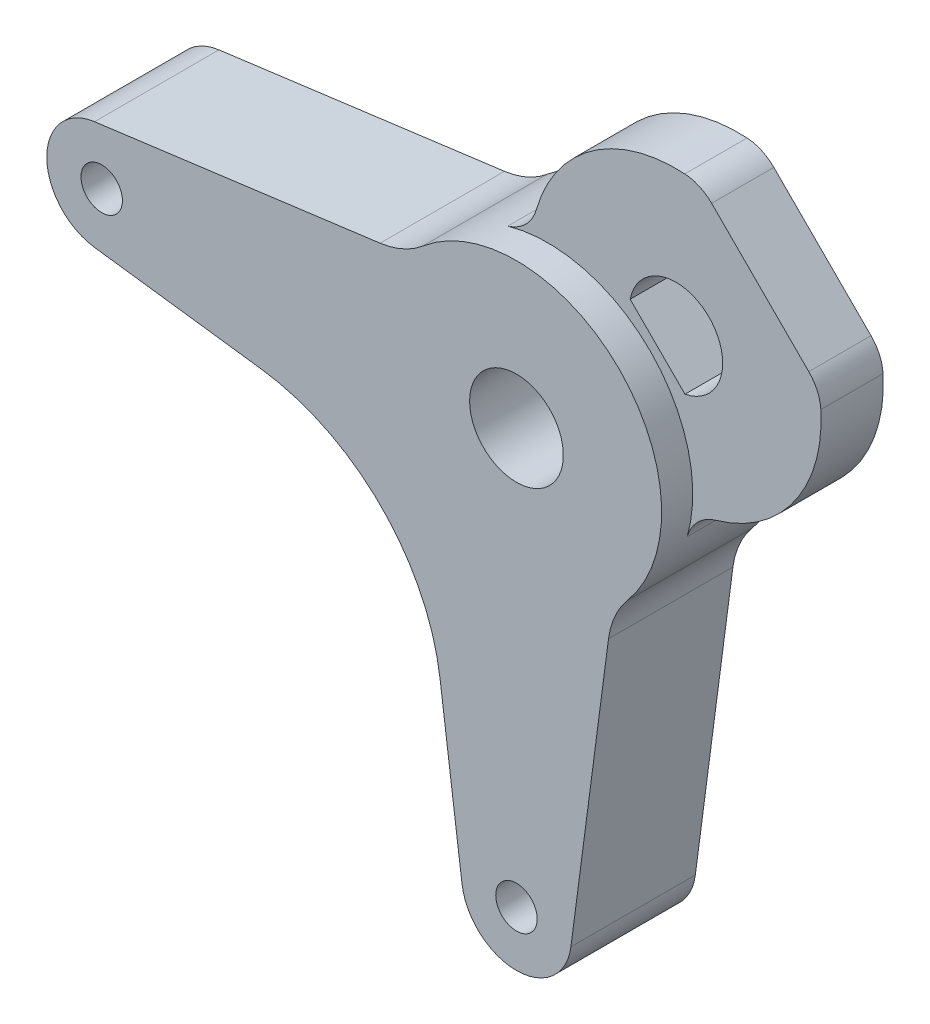
ISO-10303-21;
HEADER;
FILE_DESCRIPTION(('STEP AP214'),'2;1');
FILE_NAME('part.step','',(''),(''),'','','');
FILE_SCHEMA(('AUTOMOTIVE_DESIGN { 1 0 10303 214 1 1 1 1 }'));
ENDSEC;
DATA;
#1=APPLICATION_CONTEXT('core data for automotive mechanical design processes');
#2=APPLICATION_PROTOCOL_DEFINITION('international standard','automotive_design',2000,#1);
#3=PRODUCT_CONTEXT('',#1,'mechanical');
#4=PRODUCT('Part','Part','',(#3));
#5=PRODUCT_RELATED_PRODUCT_CATEGORY('part','',(#4));
#6=PRODUCT_DEFINITION_FORMATION('','',#4);
#7=PRODUCT_DEFINITION_CONTEXT('part definition',#1,'design');
#8=PRODUCT_DEFINITION('design','',#6,#7);
#9=PRODUCT_DEFINITION_SHAPE('','',#8);
#10=(LENGTH_UNIT() NAMED_UNIT(*) SI_UNIT(.MILLI.,.METRE.));
#11=(NAMED_UNIT(*) PLANE_ANGLE_UNIT() SI_UNIT($,.RADIAN.));
#12=(NAMED_UNIT(*) SI_UNIT($,.STERADIAN.) SOLID_ANGLE_UNIT());
#13=UNCERTAINTY_MEASURE_WITH_UNIT(LENGTH_MEASURE(1.E-05),#10,'distance_accuracy_value','');
#14=(GEOMETRIC_REPRESENTATION_CONTEXT(3) GLOBAL_UNCERTAINTY_ASSIGNED_CONTEXT((#13)) GLOBAL_UNIT_ASSIGNED_CONTEXT((#10,
#11,#12)) REPRESENTATION_CONTEXT('',''));
#15=CARTESIAN_POINT('',(0.,0.,0.));
#16=DIRECTION('',(0.,0.,1.));
#17=DIRECTION('',(1.,0.,0.));
#18=AXIS2_PLACEMENT_3D('',#15,#16,#17);
#19=CARTESIAN_POINT('',(0.,0.,19.05));
#20=DIRECTION('',(0.,0.,-1.));
#21=DIRECTION('',(-1.,0.,0.));
#22=AXIS2_PLACEMENT_3D('',#19,#20,#21);
#23=CYLINDRICAL_SURFACE('',#22,44.45);
#24=CARTESIAN_POINT('',(0.,0.,-19.05));
#25=DIRECTION('',(0.,0.,1.));
#26=DIRECTION('',(1.,0.,0.));
#27=AXIS2_PLACEMENT_3D('',#24,#25,#26);
#28=CIRCLE('',#27,44.45);
#29=CARTESIAN_POINT('',(33.9599323815582,-28.6797052397684,-19.05));
#30=VERTEX_POINT('',#29);
#31=CARTESIAN_POINT('',(-28.6797052397684,33.9599323815581,-19.05));
#32=VERTEX_POINT('',#31);
#33=EDGE_CURVE('E293',#30,#32,#28,.T.);
#34=ORIENTED_EDGE('',*,*,#33,.T.);
#35=DIRECTION('',(0.,0.,-1.));
#36=VECTOR('',#35,1.);
#37=CARTESIAN_POINT('',(-28.6797052397684,33.9599323815581,19.05));
#38=LINE('',#37,#36);
#39=CARTESIAN_POINT('',(-28.6797052397684,33.9599323815581,19.05));
#40=VERTEX_POINT('',#39);
#41=EDGE_CURVE('E363',#40,#32,#38,.T.);
#42=ORIENTED_EDGE('',*,*,#41,.F.);
#43=CARTESIAN_POINT('',(0.,0.,19.05));
#44=DIRECTION('',(0.,0.,1.));
#45=DIRECTION('',(1.,0.,0.));
#46=AXIS2_PLACEMENT_3D('',#43,#44,#45);
#47=CIRCLE('',#46,44.45);
#48=CARTESIAN_POINT('',(33.9599323815582,-28.6797052397684,19.05));
#49=VERTEX_POINT('',#48);
#50=EDGE_CURVE('E245',#49,#40,#47,.T.);
#51=ORIENTED_EDGE('',*,*,#50,.F.);
#52=DIRECTION('',(0.,0.,-1.));
#53=VECTOR('',#52,1.);
#54=CARTESIAN_POINT('',(33.9599323815582,-28.6797052397684,19.05));
#55=LINE('',#54,#53);
#56=EDGE_CURVE('E366',#49,#30,#55,.T.);
#57=ORIENTED_EDGE('',*,*,#56,.T.);
#58=EDGE_LOOP('',(#34,#42,#51,#57));
#59=FACE_BOUND('',#58,.T.);
#60=CARTESIAN_POINT('',(0.,0.,-9.525));
#61=DIRECTION('',(0.,0.,-1.));
#62=DIRECTION('',(1.,0.,0.));
#63=AXIS2_PLACEMENT_3D('',#60,#61,#62);
#64=CIRCLE('',#63,44.45);
#65=CARTESIAN_POINT('',(-12.1736804671059,42.7504854227973,-9.525));
#66=VERTEX_POINT('',#65);
#67=CARTESIAN_POINT('',(42.7504854227974,-12.1736804671054,-9.525));
#68=VERTEX_POINT('',#67);
#69=EDGE_CURVE('E231',#66,#68,#64,.T.);
#70=ORIENTED_EDGE('',*,*,#69,.T.);
#71=DIRECTION('',(0.,0.,-1.));
#72=VECTOR('',#71,1.);
#73=CARTESIAN_POINT('',(42.7504854227974,-12.1736804671054,19.05));
#74=LINE('',#73,#72);
#75=CARTESIAN_POINT('',(42.7504854227974,-12.1736804671054,9.525));
#76=VERTEX_POINT('',#75);
#77=EDGE_CURVE('E380',#68,#76,#74,.F.);
#78=ORIENTED_EDGE('',*,*,#77,.T.);
#79=CARTESIAN_POINT('',(0.,0.,9.525));
#80=DIRECTION('',(0.,0.,-1.));
#81=DIRECTION('',(1.,0.,0.));
#82=AXIS2_PLACEMENT_3D('',#79,#80,#81);
#83=CIRCLE('',#82,44.45);
#84=CARTESIAN_POINT('',(-12.1736804671059,42.7504854227973,9.525));
#85=VERTEX_POINT('',#84);
#86=EDGE_CURVE('E217',#85,#76,#83,.T.);
#87=ORIENTED_EDGE('',*,*,#86,.F.);
#88=DIRECTION('',(0.,0.,-1.));
#89=VECTOR('',#88,1.);
#90=CARTESIAN_POINT('',(-12.1736804671059,42.7504854227973,19.05));
#91=LINE('',#90,#89);
#92=EDGE_CURVE('E376',#85,#66,#91,.T.);
#93=ORIENTED_EDGE('',*,*,#92,.T.);
#94=EDGE_LOOP('',(#70,#78,#87,#93));
#95=FACE_BOUND('',#94,.T.);
#96=ADVANCED_FACE('F43',(#59,#95),#23,.T.);
#97=CARTESIAN_POINT('',(53.3656080281628,-45.0681082339217,19.05));
#98=DIRECTION('',(0.,0.,-1.));
#99=DIRECTION('',(-1.,0.,0.));
#100=AXIS2_PLACEMENT_3D('',#97,#98,#99);
#101=CYLINDRICAL_SURFACE('',#100,25.4);
#102=CARTESIAN_POINT('',(53.3656080281628,-45.0681082339217,-19.05));
#103=DIRECTION('',(0.,0.,1.));
#104=DIRECTION('',(1.,0.,0.));
#105=AXIS2_PLACEMENT_3D('',#102,#103,#104);
#106=CIRCLE('',#105,25.4);
#107=CARTESIAN_POINT('',(28.182908549268,-41.7527429515326,-19.05));
#108=VERTEX_POINT('',#107);
#109=EDGE_CURVE('E228',#30,#108,#106,.T.);
#110=ORIENTED_EDGE('',*,*,#109,.F.);
#111=ORIENTED_EDGE('',*,*,#56,.F.);
#112=CARTESIAN_POINT('',(53.3656080281628,-45.0681082339217,19.05));
#113=DIRECTION('',(0.,0.,1.));
#114=DIRECTION('',(1.,0.,0.));
#115=AXIS2_PLACEMENT_3D('',#112,#113,#114);
#116=CIRCLE('',#115,25.4);
#117=CARTESIAN_POINT('',(28.182908549268,-41.7527429515326,19.05));
#118=VERTEX_POINT('',#117);
#119=EDGE_CURVE('E241',#49,#118,#116,.T.);
#120=ORIENTED_EDGE('',*,*,#119,.T.);
#121=DIRECTION('',(0.,0.,-1.));
#122=VECTOR('',#121,1.);
#123=CARTESIAN_POINT('',(28.182908549268,-41.7527429515326,19.05));
#124=LINE('',#123,#122);
#125=EDGE_CURVE('E289',#118,#108,#124,.T.);
#126=ORIENTED_EDGE('',*,*,#125,.T.);
#127=EDGE_LOOP('',(#110,#111,#120,#126));
#128=FACE_BOUND('',#127,.T.);
#129=ADVANCED_FACE('F448',(#128),#101,.F.);
#130=CARTESIAN_POINT('',(-45.0681082339217,53.3656080281628,19.05));
#131=DIRECTION('',(0.,0.,-1.));
#132=DIRECTION('',(-1.,0.,0.));
#133=AXIS2_PLACEMENT_3D('',#130,#131,#132);
#134=CYLINDRICAL_SURFACE('',#133,25.4);
#135=CARTESIAN_POINT('',(-45.0681082339217,53.3656080281628,-19.05));
#136=DIRECTION('',(0.,0.,1.));
#137=DIRECTION('',(1.,0.,0.));
#138=AXIS2_PLACEMENT_3D('',#135,#136,#137);
#139=CIRCLE('',#138,25.4);
#140=CARTESIAN_POINT('',(-41.7527429515326,28.182908549268,-19.05));
#141=VERTEX_POINT('',#140);
#142=EDGE_CURVE('E297',#141,#32,#139,.T.);
#143=ORIENTED_EDGE('',*,*,#142,.F.);
#144=DIRECTION('',(0.,0.,-1.));
#145=VECTOR('',#144,1.);
#146=CARTESIAN_POINT('',(-41.7527429515326,28.182908549268,19.05));
#147=LINE('',#146,#145);
#148=CARTESIAN_POINT('',(-41.7527429515326,28.182908549268,19.05));
#149=VERTEX_POINT('',#148);
#150=EDGE_CURVE('E360',#149,#141,#147,.T.);
#151=ORIENTED_EDGE('',*,*,#150,.F.);
#152=CARTESIAN_POINT('',(-45.0681082339217,53.3656080281628,19.05));
#153=DIRECTION('',(0.,0.,1.));
#154=DIRECTION('',(1.,0.,0.));
#155=AXIS2_PLACEMENT_3D('',#152,#153,#154);
#156=CIRCLE('',#155,25.4);
#157=EDGE_CURVE('E249',#149,#40,#156,.T.);
#158=ORIENTED_EDGE('',*,*,#157,.T.);
#159=ORIENTED_EDGE('',*,*,#41,.T.);
#160=EDGE_LOOP('',(#143,#151,#158,#159));
#161=FACE_BOUND('',#160,.T.);
#162=ADVANCED_FACE('F454',(#161),#134,.F.);
#163=CARTESIAN_POINT('',(-4.35848184758556,33.1059564190376,19.05));
#164=DIRECTION('',(-0.130526192220045,0.991444861373811,0.));
#165=DIRECTION('',(-0.991444861373811,-0.130526192220045,0.));
#166=AXIS2_PLACEMENT_3D('',#163,#164,#165);
#167=PLANE('',#166);
#168=DIRECTION('',(0.991444861373811,0.130526192220045,0.));
#169=VECTOR('',#168,1.);
#170=CARTESIAN_POINT('',(-4.35848184758556,33.1059564190376,-19.05));
#171=LINE('',#170,#169);
#172=CARTESIAN_POINT('',(-129.194771816942,16.6709470550283,-19.05));
#173=VERTEX_POINT('',#172);
#174=EDGE_CURVE('E301',#173,#141,#171,.T.);
#175=ORIENTED_EDGE('',*,*,#174,.F.);
#176=DIRECTION('',(0.,0.,-1.));
#177=VECTOR('',#176,1.);
#178=CARTESIAN_POINT('',(-129.194771816942,16.6709470550283,19.05));
#179=LINE('',#178,#177);
#180=CARTESIAN_POINT('',(-129.194771816942,16.6709470550283,19.05));
#181=VERTEX_POINT('',#180);
#182=EDGE_CURVE('E357',#181,#173,#179,.T.);
#183=ORIENTED_EDGE('',*,*,#182,.F.);
#184=DIRECTION('',(0.991444861373811,0.130526192220045,0.));
#185=VECTOR('',#184,1.);
#186=CARTESIAN_POINT('',(-4.35848184758556,33.1059564190376,19.05));
#187=LINE('',#186,#185);
#188=EDGE_CURVE('E253',#181,#149,#187,.T.);
#189=ORIENTED_EDGE('',*,*,#188,.T.);
#190=ORIENTED_EDGE('',*,*,#150,.T.);
#191=EDGE_LOOP('',(#175,#183,#189,#190));
#192=FACE_BOUND('',#191,.T.);
#193=ADVANCED_FACE('F676',(#192),#167,.T.);
#194=CARTESIAN_POINT('',(-127.,0.,19.05));
#195=DIRECTION('',(0.,0.,-1.));
#196=DIRECTION('',(-1.,0.,0.));
#197=AXIS2_PLACEMENT_3D('',#194,#195,#196);
#198=CYLINDRICAL_SURFACE('',#197,16.8148);
#199=CARTESIAN_POINT('',(-127.,0.,-19.05));
#200=DIRECTION('',(0.,0.,1.));
#201=DIRECTION('',(1.,0.,0.));
#202=AXIS2_PLACEMENT_3D('',#199,#200,#201);
#203=CIRCLE('',#202,16.8148);
#204=CARTESIAN_POINT('',(-129.194771816942,-16.6709470550284,-19.05));
#205=VERTEX_POINT('',#204);
#206=EDGE_CURVE('E305',#173,#205,#203,.T.);
#207=ORIENTED_EDGE('',*,*,#206,.T.);
#208=DIRECTION('',(0.,0.,-1.));
#209=VECTOR('',#208,1.);
#210=CARTESIAN_POINT('',(-129.194771816942,-16.6709470550284,19.05));
#211=LINE('',#210,#209);
#212=CARTESIAN_POINT('',(-129.194771816942,-16.6709470550284,19.05));
#213=VERTEX_POINT('',#212);
#214=EDGE_CURVE('E353',#213,#205,#211,.T.);
#215=ORIENTED_EDGE('',*,*,#214,.F.);
#216=CARTESIAN_POINT('',(-127.,0.,19.05));
#217=DIRECTION('',(0.,0.,1.));
#218=DIRECTION('',(1.,0.,0.));
#219=AXIS2_PLACEMENT_3D('',#216,#217,#218);
#220=CIRCLE('',#219,16.8148);
#221=EDGE_CURVE('E257',#181,#213,#220,.T.);
#222=ORIENTED_EDGE('',*,*,#221,.F.);
#223=ORIENTED_EDGE('',*,*,#182,.T.);
#224=EDGE_LOOP('',(#207,#215,#222,#223));
#225=FACE_BOUND('',#224,.T.);
#226=ADVANCED_FACE('F665',(#225),#198,.T.);
#227=CARTESIAN_POINT('',(-4.35848184758554,-33.1059564190376,19.05));
#228=DIRECTION('',(0.130526192220045,0.991444861373811,0.));
#229=DIRECTION('',(-0.991444861373811,0.130526192220045,0.));
#230=AXIS2_PLACEMENT_3D('',#227,#228,#229);
#231=PLANE('',#230);
#232=DIRECTION('',(0.991444861373811,-0.130526192220045,0.));
#233=VECTOR('',#232,1.);
#234=CARTESIAN_POINT('',(-4.35848184758554,-33.1059564190376,-19.05));
#235=LINE('',#234,#233);
#236=CARTESIAN_POINT('',(-78.0699880215687,-23.4016525303045,-19.05));
#237=VERTEX_POINT('',#236);
#238=EDGE_CURVE('E308',#205,#237,#235,.T.);
#239=ORIENTED_EDGE('',*,*,#238,.T.);
#240=DIRECTION('',(0.,0.,-1.));
#241=VECTOR('',#240,1.);
#242=CARTESIAN_POINT('',(-78.0699880215687,-23.4016525303045,19.05));
#243=LINE('',#242,#241);
#244=CARTESIAN_POINT('',(-78.0699880215687,-23.4016525303045,19.05));
#245=VERTEX_POINT('',#244);
#246=EDGE_CURVE('E350',#245,#237,#243,.T.);
#247=ORIENTED_EDGE('',*,*,#246,.F.);
#248=DIRECTION('',(0.991444861373811,-0.130526192220045,0.));
#249=VECTOR('',#248,1.);
#250=CARTESIAN_POINT('',(-4.35848184758554,-33.1059564190376,19.05));
#251=LINE('',#250,#249);
#252=EDGE_CURVE('E260',#213,#245,#251,.T.);
#253=ORIENTED_EDGE('',*,*,#252,.F.);
#254=ORIENTED_EDGE('',*,*,#214,.T.);
#255=EDGE_LOOP('',(#239,#247,#253,#254));
#256=FACE_BOUND('',#255,.T.);
#257=ADVANCED_FACE('F654',(#256),#231,.F.);
#258=CARTESIAN_POINT('',(-86.3584012275415,-86.3584012275415,19.05));
#259=DIRECTION('',(0.,0.,-1.));
#260=DIRECTION('',(-1.,0.,0.));
#261=AXIS2_PLACEMENT_3D('',#258,#259,#260);
#262=CYLINDRICAL_SURFACE('',#261,63.5);
#263=CARTESIAN_POINT('',(-86.3584012275415,-86.3584012275415,-19.05));
#264=DIRECTION('',(0.,0.,1.));
#265=DIRECTION('',(1.,0.,0.));
#266=AXIS2_PLACEMENT_3D('',#263,#264,#265);
#267=CIRCLE('',#266,63.5);
#268=CARTESIAN_POINT('',(-23.4016525303045,-78.0699880215686,-19.05));
#269=VERTEX_POINT('',#268);
#270=EDGE_CURVE('E312',#269,#237,#267,.T.);
#271=ORIENTED_EDGE('',*,*,#270,.F.);
#272=DIRECTION('',(0.,0.,-1.));
#273=VECTOR('',#272,1.);
#274=CARTESIAN_POINT('',(-23.4016525303045,-78.0699880215686,19.05));
#275=LINE('',#274,#273);
#276=CARTESIAN_POINT('',(-23.4016525303045,-78.0699880215686,19.05));
#277=VERTEX_POINT('',#276);
#278=EDGE_CURVE('E347',#277,#269,#275,.T.);
#279=ORIENTED_EDGE('',*,*,#278,.F.);
#280=CARTESIAN_POINT('',(-86.3584012275415,-86.3584012275415,19.05));
#281=DIRECTION('',(0.,0.,1.));
#282=DIRECTION('',(1.,0.,0.));
#283=AXIS2_PLACEMENT_3D('',#280,#281,#282);
#284=CIRCLE('',#283,63.5);
#285=EDGE_CURVE('E263',#277,#245,#284,.T.);
#286=ORIENTED_EDGE('',*,*,#285,.T.);
#287=ORIENTED_EDGE('',*,*,#246,.T.);
#288=EDGE_LOOP('',(#271,#279,#286,#287));
#289=FACE_BOUND('',#288,.T.);
#290=ADVANCED_FACE('F643',(#289),#262,.F.);
#291=CARTESIAN_POINT('',(-33.1059564190376,-4.35848184758555,19.05));
#292=DIRECTION('',(-0.991444861373811,-0.130526192220045,0.));
#293=DIRECTION('',(0.130526192220045,-0.991444861373811,0.));
#294=AXIS2_PLACEMENT_3D('',#291,#292,#293);
#295=PLANE('',#294);
#296=DIRECTION('',(-0.130526192220045,0.991444861373811,0.));
#297=VECTOR('',#296,1.);
#298=CARTESIAN_POINT('',(-33.1059564190376,-4.35848184758555,-19.05));
#299=LINE('',#298,#297);
#300=CARTESIAN_POINT('',(-16.6709470550284,-129.194771816942,-19.05));
#301=VERTEX_POINT('',#300);
#302=EDGE_CURVE('E316',#301,#269,#299,.T.);
#303=ORIENTED_EDGE('',*,*,#302,.F.);
#304=DIRECTION('',(0.,0.,-1.));
#305=VECTOR('',#304,1.);
#306=CARTESIAN_POINT('',(-16.6709470550284,-129.194771816942,19.05));
#307=LINE('',#306,#305);
#308=CARTESIAN_POINT('',(-16.6709470550284,-129.194771816942,19.05));
#309=VERTEX_POINT('',#308);
#310=EDGE_CURVE('E344',#309,#301,#307,.T.);
#311=ORIENTED_EDGE('',*,*,#310,.F.);
#312=DIRECTION('',(-0.130526192220045,0.991444861373811,0.));
#313=VECTOR('',#312,1.);
#314=CARTESIAN_POINT('',(-33.1059564190376,-4.35848184758555,19.05));
#315=LINE('',#314,#313);
#316=EDGE_CURVE('E267',#309,#277,#315,.T.);
#317=ORIENTED_EDGE('',*,*,#316,.T.);
#318=ORIENTED_EDGE('',*,*,#278,.T.);
#319=EDGE_LOOP('',(#303,#311,#317,#318));
#320=FACE_BOUND('',#319,.T.);
#321=ADVANCED_FACE('F632',(#320),#295,.T.);
#322=CARTESIAN_POINT('',(0.,-127.,19.05));
#323=DIRECTION('',(0.,0.,-1.));
#324=DIRECTION('',(-1.,0.,0.));
#325=AXIS2_PLACEMENT_3D('',#322,#323,#324);
#326=CYLINDRICAL_SURFACE('',#325,16.8148);
#327=CARTESIAN_POINT('',(0.,-127.,-19.05));
#328=DIRECTION('',(0.,0.,1.));
#329=DIRECTION('',(1.,0.,0.));
#330=AXIS2_PLACEMENT_3D('',#327,#328,#329);
#331=CIRCLE('',#330,16.8148);
#332=CARTESIAN_POINT('',(16.6709470550284,-129.194771816942,-19.05));
#333=VERTEX_POINT('',#332);
#334=EDGE_CURVE('E320',#301,#333,#331,.T.);
#335=ORIENTED_EDGE('',*,*,#334,.T.);
#336=DIRECTION('',(0.,0.,-1.));
#337=VECTOR('',#336,1.);
#338=CARTESIAN_POINT('',(16.6709470550284,-129.194771816942,19.05));
#339=LINE('',#338,#337);
#340=CARTESIAN_POINT('',(16.6709470550284,-129.194771816942,19.05));
#341=VERTEX_POINT('',#340);
#342=EDGE_CURVE('E340',#341,#333,#339,.T.);
#343=ORIENTED_EDGE('',*,*,#342,.F.);
#344=CARTESIAN_POINT('',(0.,-127.,19.05));
#345=DIRECTION('',(0.,0.,1.));
#346=DIRECTION('',(1.,0.,0.));
#347=AXIS2_PLACEMENT_3D('',#344,#345,#346);
#348=CIRCLE('',#347,16.8148);
#349=EDGE_CURVE('E271',#309,#341,#348,.T.);
#350=ORIENTED_EDGE('',*,*,#349,.F.);
#351=ORIENTED_EDGE('',*,*,#310,.T.);
#352=EDGE_LOOP('',(#335,#343,#350,#351));
#353=FACE_BOUND('',#352,.T.);
#354=ADVANCED_FACE('F621',(#353),#326,.T.);
#355=CARTESIAN_POINT('',(-127.,0.,19.05));
#356=DIRECTION('',(0.,0.,-1.));
#357=DIRECTION('',(-1.,0.,0.));
#358=AXIS2_PLACEMENT_3D('',#355,#356,#357);
#359=CYLINDRICAL_SURFACE('',#358,6.35);
#360=CARTESIAN_POINT('',(-127.,0.,19.05));
#361=DIRECTION('',(0.,0.,1.));
#362=DIRECTION('',(1.,0.,0.));
#363=AXIS2_PLACEMENT_3D('',#360,#361,#362);
#364=CIRCLE('',#363,6.35);
#365=CARTESIAN_POINT('',(-133.35,0.,19.05));
#366=VERTEX_POINT('',#365);
#367=EDGE_CURVE('E281',#366,#366,#364,.T.);
#368=CARTESIAN_POINT('',(-127.,0.,-19.05));
#369=DIRECTION('',(0.,0.,1.));
#370=DIRECTION('',(1.,0.,0.));
#371=AXIS2_PLACEMENT_3D('',#368,#369,#370);
#372=CIRCLE('',#371,6.35);
#373=CARTESIAN_POINT('',(-133.35,0.,-19.05));
#374=VERTEX_POINT('',#373);
#375=EDGE_CURVE('E331',#374,#374,#372,.T.);
#376=CARTESIAN_POINT('',(-133.35,0.,19.05));
#377=CARTESIAN_POINT('',(-133.35,0.,18.653125));
#378=CARTESIAN_POINT('',(-133.35,0.,18.25625));
#379=CARTESIAN_POINT('',(-133.35,0.,17.4625));
#380=CARTESIAN_POINT('',(-133.35,0.,17.065625));
#381=CARTESIAN_POINT('',(-133.35,0.,16.271875));
#382=CARTESIAN_POINT('',(-133.35,0.,15.875));
#383=CARTESIAN_POINT('',(-133.35,0.,15.08125));
#384=CARTESIAN_POINT('',(-133.35,0.,14.684375));
#385=CARTESIAN_POINT('',(-133.35,0.,13.890625));
#386=CARTESIAN_POINT('',(-133.35,0.,13.49375));
#387=CARTESIAN_POINT('',(-133.35,0.,12.7));
#388=CARTESIAN_POINT('',(-133.35,0.,12.303125));
#389=CARTESIAN_POINT('',(-133.35,0.,11.509375));
#390=CARTESIAN_POINT('',(-133.35,0.,11.1125));
#391=CARTESIAN_POINT('',(-133.35,0.,10.31875));
#392=CARTESIAN_POINT('',(-133.35,0.,9.921875));
#393=CARTESIAN_POINT('',(-133.35,0.,9.128125));
#394=CARTESIAN_POINT('',(-133.35,0.,8.73125));
#395=CARTESIAN_POINT('',(-133.35,0.,7.9375));
#396=CARTESIAN_POINT('',(-133.35,0.,7.540625));
#397=CARTESIAN_POINT('',(-133.35,0.,6.746875));
#398=CARTESIAN_POINT('',(-133.35,0.,6.35));
#399=CARTESIAN_POINT('',(-133.35,0.,5.55625));
#400=CARTESIAN_POINT('',(-133.35,0.,5.159375));
#401=CARTESIAN_POINT('',(-133.35,0.,4.365625));
#402=CARTESIAN_POINT('',(-133.35,0.,3.96875));
#403=CARTESIAN_POINT('',(-133.35,0.,3.175));
#404=CARTESIAN_POINT('',(-133.35,0.,2.778125));
#405=CARTESIAN_POINT('',(-133.35,0.,1.984375));
#406=CARTESIAN_POINT('',(-133.35,0.,1.5875));
#407=CARTESIAN_POINT('',(-133.35,0.,0.793749999999997));
#408=CARTESIAN_POINT('',(-133.35,0.,0.396874999999997));
#409=CARTESIAN_POINT('',(-133.35,0.,-0.396875000000004));
#410=CARTESIAN_POINT('',(-133.35,0.,-0.793750000000004));
#411=CARTESIAN_POINT('',(-133.35,0.,-1.5875));
#412=CARTESIAN_POINT('',(-133.35,0.,-1.984375));
#413=CARTESIAN_POINT('',(-133.35,0.,-2.77812500000001));
#414=CARTESIAN_POINT('',(-133.35,0.,-3.17500000000001));
#415=CARTESIAN_POINT('',(-133.35,0.,-3.96875000000001));
#416=CARTESIAN_POINT('',(-133.35,0.,-4.36562500000001));
#417=CARTESIAN_POINT('',(-133.35,0.,-5.15937500000001));
#418=CARTESIAN_POINT('',(-133.35,0.,-5.55625));
#419=CARTESIAN_POINT('',(-133.35,0.,-6.35));
#420=CARTESIAN_POINT('',(-133.35,0.,-6.746875));
#421=CARTESIAN_POINT('',(-133.35,0.,-7.540625));
#422=CARTESIAN_POINT('',(-133.35,0.,-7.93750000000001));
#423=CARTESIAN_POINT('',(-133.35,0.,-8.73125));
#424=CARTESIAN_POINT('',(-133.35,0.,-9.12812500000001));
#425=CARTESIAN_POINT('',(-133.35,0.,-9.92187500000001));
#426=CARTESIAN_POINT('',(-133.35,0.,-10.31875));
#427=CARTESIAN_POINT('',(-133.35,0.,-11.1125));
#428=CARTESIAN_POINT('',(-133.35,0.,-11.509375));
#429=CARTESIAN_POINT('',(-133.35,0.,-12.303125));
#430=CARTESIAN_POINT('',(-133.35,0.,-12.7));
#431=CARTESIAN_POINT('',(-133.35,0.,-13.49375));
#432=CARTESIAN_POINT('',(-133.35,0.,-13.890625));
#433=CARTESIAN_POINT('',(-133.35,0.,-14.684375));
#434=CARTESIAN_POINT('',(-133.35,0.,-15.08125));
#435=CARTESIAN_POINT('',(-133.35,0.,-15.875));
#436=CARTESIAN_POINT('',(-133.35,0.,-16.271875));
#437=CARTESIAN_POINT('',(-133.35,0.,-17.065625));
#438=CARTESIAN_POINT('',(-133.35,0.,-17.4625));
#439=CARTESIAN_POINT('',(-133.35,0.,-18.25625));
#440=CARTESIAN_POINT('',(-133.35,0.,-18.653125));
#441=CARTESIAN_POINT('',(-133.35,0.,-19.05));
#442=B_SPLINE_CURVE_WITH_KNOTS('',3,(#376,#377,#378,#379,#380,#381,#382,#383,#384,#385,#386,
#387,#388,#389,#390,#391,#392,#393,#394,#395,#396,#397,#398,#399,#400,#401,#402,#403,#404,#405,
#406,#407,#408,#409,#410,#411,#412,#413,#414,#415,#416,#417,#418,#419,#420,#421,#422,#423,#424,
#425,#426,#427,#428,#429,#430,#431,#432,#433,#434,#435,#436,#437,#438,#439,#440,#441),
.UNSPECIFIED.,.F.,.F.,(4,2,2,2,2,2,2,2,2,2,2,2,2,2,2,2,2,2,2,2,2,2,2,2,2,2,2,2,2,2,2,2,4),(0.,
1.190625,2.38125,3.571875,4.7625,5.953125,7.14375,8.334375,9.525,10.715625,11.90625,13.096875,
14.2875,15.478125,16.66875,17.859375,19.05,20.240625,21.43125,22.621875,23.8125,25.003125,
26.19375,27.384375,28.575,29.765625,30.95625,32.146875,33.3375,34.528125,35.71875,36.909375,
38.1),.UNSPECIFIED.);
#443=EDGE_CURVE('BSEAM610',#366,#374,#442,.T.);
#444=ORIENTED_EDGE('',*,*,#367,.T.);
#445=ORIENTED_EDGE('',*,*,#375,.F.);
#446=ORIENTED_EDGE('',*,*,#443,.T.);
#447=ORIENTED_EDGE('',*,*,#443,.F.);
#448=EDGE_LOOP('',(#444,#446,#445,#447));
#449=FACE_BOUND('',#448,.T.);
#450=ADVANCED_FACE('F610',(#449),#359,.F.);
#451=CARTESIAN_POINT('',(0.,-127.,19.05));
#452=DIRECTION('',(0.,0.,-1.));
#453=DIRECTION('',(-1.,0.,0.));
#454=AXIS2_PLACEMENT_3D('',#451,#452,#453);
#455=CYLINDRICAL_SURFACE('',#454,6.35);
#456=CARTESIAN_POINT('',(0.,-127.,19.05));
#457=DIRECTION('',(0.,0.,1.));
#458=DIRECTION('',(1.,0.,0.));
#459=AXIS2_PLACEMENT_3D('',#456,#457,#458);
#460=CIRCLE('',#459,6.35);
#461=CARTESIAN_POINT('',(-6.34999999999998,-127.,19.05));
#462=VERTEX_POINT('',#461);
#463=EDGE_CURVE('E277',#462,#462,#460,.T.);
#464=CARTESIAN_POINT('',(0.,-127.,-19.05));
#465=DIRECTION('',(0.,0.,1.));
#466=DIRECTION('',(1.,0.,0.));
#467=AXIS2_PLACEMENT_3D('',#464,#465,#466);
#468=CIRCLE('',#467,6.35);
#469=CARTESIAN_POINT('',(-6.34999999999998,-127.,-19.05));
#470=VERTEX_POINT('',#469);
#471=EDGE_CURVE('E327',#470,#470,#468,.T.);
#472=CARTESIAN_POINT('',(-6.34999999999998,-127.,19.05));
#473=CARTESIAN_POINT('',(-6.34999999999998,-127.,18.653125));
#474=CARTESIAN_POINT('',(-6.34999999999998,-127.,18.25625));
#475=CARTESIAN_POINT('',(-6.34999999999998,-127.,17.4625));
#476=CARTESIAN_POINT('',(-6.34999999999998,-127.,17.065625));
#477=CARTESIAN_POINT('',(-6.34999999999998,-127.,16.271875));
#478=CARTESIAN_POINT('',(-6.34999999999998,-127.,15.875));
#479=CARTESIAN_POINT('',(-6.34999999999998,-127.,15.08125));
#480=CARTESIAN_POINT('',(-6.34999999999998,-127.,14.684375));
#481=CARTESIAN_POINT('',(-6.34999999999998,-127.,13.890625));
#482=CARTESIAN_POINT('',(-6.34999999999998,-127.,13.49375));
#483=CARTESIAN_POINT('',(-6.34999999999998,-127.,12.7));
#484=CARTESIAN_POINT('',(-6.34999999999998,-127.,12.303125));
#485=CARTESIAN_POINT('',(-6.34999999999998,-127.,11.509375));
#486=CARTESIAN_POINT('',(-6.34999999999998,-127.,11.1125));
#487=CARTESIAN_POINT('',(-6.34999999999998,-127.,10.31875));
#488=CARTESIAN_POINT('',(-6.34999999999998,-127.,9.921875));
#489=CARTESIAN_POINT('',(-6.34999999999998,-127.,9.128125));
#490=CARTESIAN_POINT('',(-6.34999999999998,-127.,8.73125));
#491=CARTESIAN_POINT('',(-6.34999999999998,-127.,7.9375));
#492=CARTESIAN_POINT('',(-6.34999999999998,-127.,7.540625));
#493=CARTESIAN_POINT('',(-6.34999999999998,-127.,6.746875));
#494=CARTESIAN_POINT('',(-6.34999999999998,-127.,6.35));
#495=CARTESIAN_POINT('',(-6.34999999999998,-127.,5.55625));
#496=CARTESIAN_POINT('',(-6.34999999999998,-127.,5.159375));
#497=CARTESIAN_POINT('',(-6.34999999999998,-127.,4.365625));
#498=CARTESIAN_POINT('',(-6.34999999999998,-127.,3.96875));
#499=CARTESIAN_POINT('',(-6.34999999999998,-127.,3.175));
#500=CARTESIAN_POINT('',(-6.34999999999998,-127.,2.778125));
#501=CARTESIAN_POINT('',(-6.34999999999998,-127.,1.984375));
#502=CARTESIAN_POINT('',(-6.34999999999998,-127.,1.5875));
#503=CARTESIAN_POINT('',(-6.34999999999998,-127.,0.793749999999997));
#504=CARTESIAN_POINT('',(-6.34999999999998,-127.,0.396874999999997));
#505=CARTESIAN_POINT('',(-6.34999999999998,-127.,-0.396875000000004));
#506=CARTESIAN_POINT('',(-6.34999999999998,-127.,-0.793750000000004));
#507=CARTESIAN_POINT('',(-6.34999999999998,-127.,-1.5875));
#508=CARTESIAN_POINT('',(-6.34999999999998,-127.,-1.984375));
#509=CARTESIAN_POINT('',(-6.34999999999998,-127.,-2.77812500000001));
#510=CARTESIAN_POINT('',(-6.34999999999998,-127.,-3.17500000000001));
#511=CARTESIAN_POINT('',(-6.34999999999998,-127.,-3.96875000000001));
#512=CARTESIAN_POINT('',(-6.34999999999998,-127.,-4.36562500000001));
#513=CARTESIAN_POINT('',(-6.34999999999998,-127.,-5.15937500000001));
#514=CARTESIAN_POINT('',(-6.34999999999998,-127.,-5.55625));
#515=CARTESIAN_POINT('',(-6.34999999999998,-127.,-6.35));
#516=CARTESIAN_POINT('',(-6.34999999999998,-127.,-6.746875));
#517=CARTESIAN_POINT('',(-6.34999999999998,-127.,-7.540625));
#518=CARTESIAN_POINT('',(-6.34999999999998,-127.,-7.93750000000001));
#519=CARTESIAN_POINT('',(-6.34999999999998,-127.,-8.73125));
#520=CARTESIAN_POINT('',(-6.34999999999998,-127.,-9.12812500000001));
#521=CARTESIAN_POINT('',(-6.34999999999998,-127.,-9.92187500000001));
#522=CARTESIAN_POINT('',(-6.34999999999998,-127.,-10.31875));
#523=CARTESIAN_POINT('',(-6.34999999999998,-127.,-11.1125));
#524=CARTESIAN_POINT('',(-6.34999999999998,-127.,-11.509375));
#525=CARTESIAN_POINT('',(-6.34999999999998,-127.,-12.303125));
#526=CARTESIAN_POINT('',(-6.34999999999998,-127.,-12.7));
#527=CARTESIAN_POINT('',(-6.34999999999998,-127.,-13.49375));
#528=CARTESIAN_POINT('',(-6.34999999999998,-127.,-13.890625));
#529=CARTESIAN_POINT('',(-6.34999999999998,-127.,-14.684375));
#530=CARTESIAN_POINT('',(-6.34999999999998,-127.,-15.08125));
#531=CARTESIAN_POINT('',(-6.34999999999998,-127.,-15.875));
#532=CARTESIAN_POINT('',(-6.34999999999998,-127.,-16.271875));
#533=CARTESIAN_POINT('',(-6.34999999999998,-127.,-17.065625));
#534=CARTESIAN_POINT('',(-6.34999999999998,-127.,-17.4625));
#535=CARTESIAN_POINT('',(-6.34999999999998,-127.,-18.25625));
#536=CARTESIAN_POINT('',(-6.34999999999998,-127.,-18.653125));
#537=CARTESIAN_POINT('',(-6.34999999999998,-127.,-19.05));
#538=B_SPLINE_CURVE_WITH_KNOTS('',3,(#472,#473,#474,#475,#476,#477,#478,#479,#480,#481,#482,
#483,#484,#485,#486,#487,#488,#489,#490,#491,#492,#493,#494,#495,#496,#497,#498,#499,#500,#501,
#502,#503,#504,#505,#506,#507,#508,#509,#510,#511,#512,#513,#514,#515,#516,#517,#518,#519,#520,
#521,#522,#523,#524,#525,#526,#527,#528,#529,#530,#531,#532,#533,#534,#535,#536,#537),
.UNSPECIFIED.,.F.,.F.,(4,2,2,2,2,2,2,2,2,2,2,2,2,2,2,2,2,2,2,2,2,2,2,2,2,2,2,2,2,2,2,2,4),(0.,
1.190625,2.38125,3.571875,4.7625,5.953125,7.14375,8.334375,9.525,10.715625,11.90625,13.096875,
14.2875,15.478125,16.66875,17.859375,19.05,20.240625,21.43125,22.621875,23.8125,25.003125,
26.19375,27.384375,28.575,29.765625,30.95625,32.146875,33.3375,34.528125,35.71875,36.909375,
38.1),.UNSPECIFIED.);
#539=EDGE_CURVE('BSEAM599',#462,#470,#538,.T.);
#540=ORIENTED_EDGE('',*,*,#463,.T.);
#541=ORIENTED_EDGE('',*,*,#471,.F.);
#542=ORIENTED_EDGE('',*,*,#539,.T.);
#543=ORIENTED_EDGE('',*,*,#539,.F.);
#544=EDGE_LOOP('',(#540,#542,#541,#543));
#545=FACE_BOUND('',#544,.T.);
#546=ADVANCED_FACE('F599',(#545),#455,.F.);
#547=CARTESIAN_POINT('',(33.1059564190376,-4.35848184758554,19.05));
#548=DIRECTION('',(-0.991444861373811,0.130526192220045,0.));
#549=DIRECTION('',(-0.130526192220045,-0.991444861373811,0.));
#550=AXIS2_PLACEMENT_3D('',#547,#548,#549);
#551=PLANE('',#550);
#552=DIRECTION('',(0.130526192220045,0.991444861373811,0.));
#553=VECTOR('',#552,1.);
#554=CARTESIAN_POINT('',(33.1059564190376,-4.35848184758554,-19.05));
#555=LINE('',#554,#553);
#556=EDGE_CURVE('E323',#333,#108,#555,.T.);
#557=ORIENTED_EDGE('',*,*,#556,.T.);
#558=ORIENTED_EDGE('',*,*,#125,.F.);
#559=DIRECTION('',(0.130526192220045,0.991444861373811,0.));
#560=VECTOR('',#559,1.);
#561=CARTESIAN_POINT('',(33.1059564190376,-4.35848184758554,19.05));
#562=LINE('',#561,#560);
#563=EDGE_CURVE('E274',#341,#118,#562,.T.);
#564=ORIENTED_EDGE('',*,*,#563,.F.);
#565=ORIENTED_EDGE('',*,*,#342,.T.);
#566=EDGE_LOOP('',(#557,#558,#564,#565));
#567=FACE_BOUND('',#566,.T.);
#568=ADVANCED_FACE('F588',(#567),#551,.F.);
#569=CARTESIAN_POINT('',(0.,0.,19.05));
#570=DIRECTION('',(0.,0.,-1.));
#571=DIRECTION('',(-1.,0.,0.));
#572=AXIS2_PLACEMENT_3D('',#569,#570,#571);
#573=CYLINDRICAL_SURFACE('',#572,14.351);
#574=CARTESIAN_POINT('',(0.,0.,19.05));
#575=DIRECTION('',(0.,0.,1.));
#576=DIRECTION('',(1.,0.,0.));
#577=AXIS2_PLACEMENT_3D('',#574,#575,#576);
#578=CIRCLE('',#577,14.351);
#579=CARTESIAN_POINT('',(-14.351,0.,19.05));
#580=VERTEX_POINT('',#579);
#581=EDGE_CURVE('E285',#580,#580,#578,.T.);
#582=CARTESIAN_POINT('',(0.,0.,-19.05));
#583=DIRECTION('',(0.,0.,1.));
#584=DIRECTION('',(1.,0.,0.));
#585=AXIS2_PLACEMENT_3D('',#582,#583,#584);
#586=CIRCLE('',#585,14.351);
#587=CARTESIAN_POINT('',(-14.351,0.,-19.05));
#588=VERTEX_POINT('',#587);
#589=EDGE_CURVE('E246',#588,#588,#586,.T.);
#590=CARTESIAN_POINT('',(-14.351,0.,19.05));
#591=CARTESIAN_POINT('',(-14.351,0.,18.653125));
#592=CARTESIAN_POINT('',(-14.351,0.,18.25625));
#593=CARTESIAN_POINT('',(-14.351,0.,17.4625));
#594=CARTESIAN_POINT('',(-14.351,0.,17.065625));
#595=CARTESIAN_POINT('',(-14.351,0.,16.271875));
#596=CARTESIAN_POINT('',(-14.351,0.,15.875));
#597=CARTESIAN_POINT('',(-14.351,0.,15.08125));
#598=CARTESIAN_POINT('',(-14.351,0.,14.684375));
#599=CARTESIAN_POINT('',(-14.351,0.,13.890625));
#600=CARTESIAN_POINT('',(-14.351,0.,13.49375));
#601=CARTESIAN_POINT('',(-14.351,0.,12.7));
#602=CARTESIAN_POINT('',(-14.351,0.,12.303125));
#603=CARTESIAN_POINT('',(-14.351,0.,11.509375));
#604=CARTESIAN_POINT('',(-14.351,0.,11.1125));
#605=CARTESIAN_POINT('',(-14.351,0.,10.31875));
#606=CARTESIAN_POINT('',(-14.351,0.,9.921875));
#607=CARTESIAN_POINT('',(-14.351,0.,9.128125));
#608=CARTESIAN_POINT('',(-14.351,0.,8.73125));
#609=CARTESIAN_POINT('',(-14.351,0.,7.9375));
#610=CARTESIAN_POINT('',(-14.351,0.,7.540625));
#611=CARTESIAN_POINT('',(-14.351,0.,6.746875));
#612=CARTESIAN_POINT('',(-14.351,0.,6.35));
#613=CARTESIAN_POINT('',(-14.351,0.,5.55625));
#614=CARTESIAN_POINT('',(-14.351,0.,5.159375));
#615=CARTESIAN_POINT('',(-14.351,0.,4.365625));
#616=CARTESIAN_POINT('',(-14.351,0.,3.96875));
#617=CARTESIAN_POINT('',(-14.351,0.,3.175));
#618=CARTESIAN_POINT('',(-14.351,0.,2.778125));
#619=CARTESIAN_POINT('',(-14.351,0.,1.984375));
#620=CARTESIAN_POINT('',(-14.351,0.,1.5875));
#621=CARTESIAN_POINT('',(-14.351,0.,0.79375));
#622=CARTESIAN_POINT('',(-14.351,0.,0.396875));
#623=CARTESIAN_POINT('',(-14.351,0.,-0.396875));
#624=CARTESIAN_POINT('',(-14.351,0.,-0.79375));
#625=CARTESIAN_POINT('',(-14.351,0.,-1.5875));
#626=CARTESIAN_POINT('',(-14.351,0.,-1.984375));
#627=CARTESIAN_POINT('',(-14.351,0.,-2.778125));
#628=CARTESIAN_POINT('',(-14.351,0.,-3.175));
#629=CARTESIAN_POINT('',(-14.351,0.,-3.96875));
#630=CARTESIAN_POINT('',(-14.351,0.,-4.365625));
#631=CARTESIAN_POINT('',(-14.351,0.,-5.159375));
#632=CARTESIAN_POINT('',(-14.351,0.,-5.55625));
#633=CARTESIAN_POINT('',(-14.351,0.,-6.35));
#634=CARTESIAN_POINT('',(-14.351,0.,-6.746875));
#635=CARTESIAN_POINT('',(-14.351,0.,-7.540625));
#636=CARTESIAN_POINT('',(-14.351,0.,-7.9375));
#637=CARTESIAN_POINT('',(-14.351,0.,-8.73125));
#638=CARTESIAN_POINT('',(-14.351,0.,-9.128125));
#639=CARTESIAN_POINT('',(-14.351,0.,-9.921875));
#640=CARTESIAN_POINT('',(-14.351,0.,-10.31875));
#641=CARTESIAN_POINT('',(-14.351,0.,-11.1125));
#642=CARTESIAN_POINT('',(-14.351,0.,-11.509375));
#643=CARTESIAN_POINT('',(-14.351,0.,-12.303125));
#644=CARTESIAN_POINT('',(-14.351,0.,-12.7));
#645=CARTESIAN_POINT('',(-14.351,0.,-13.49375));
#646=CARTESIAN_POINT('',(-14.351,0.,-13.890625));
#647=CARTESIAN_POINT('',(-14.351,0.,-14.684375));
#648=CARTESIAN_POINT('',(-14.351,0.,-15.08125));
#649=CARTESIAN_POINT('',(-14.351,0.,-15.875));
#650=CARTESIAN_POINT('',(-14.351,0.,-16.271875));
#651=CARTESIAN_POINT('',(-14.351,0.,-17.065625));
#652=CARTESIAN_POINT('',(-14.351,0.,-17.4625));
#653=CARTESIAN_POINT('',(-14.351,0.,-18.25625));
#654=CARTESIAN_POINT('',(-14.351,0.,-18.653125));
#655=CARTESIAN_POINT('',(-14.351,0.,-19.05));
#656=B_SPLINE_CURVE_WITH_KNOTS('',3,(#590,#591,#592,#593,#594,#595,#596,#597,#598,#599,#600,
#601,#602,#603,#604,#605,#606,#607,#608,#609,#610,#611,#612,#613,#614,#615,#616,#617,#618,#619,
#620,#621,#622,#623,#624,#625,#626,#627,#628,#629,#630,#631,#632,#633,#634,#635,#636,#637,#638,
#639,#640,#641,#642,#643,#644,#645,#646,#647,#648,#649,#650,#651,#652,#653,#654,#655),
.UNSPECIFIED.,.F.,.F.,(4,2,2,2,2,2,2,2,2,2,2,2,2,2,2,2,2,2,2,2,2,2,2,2,2,2,2,2,2,2,2,2,4),(0.,
1.190625,2.38125,3.571875,4.7625,5.953125,7.14375,8.334375,9.525,10.715625,11.90625,13.096875,
14.2875,15.478125,16.66875,17.859375,19.05,20.240625,21.43125,22.621875,23.8125,25.003125,
26.19375,27.384375,28.575,29.765625,30.95625,32.146875,33.3375,34.528125,35.71875,36.909375,
38.1),.UNSPECIFIED.);
#657=EDGE_CURVE('BSEAM577',#580,#588,#656,.T.);
#658=ORIENTED_EDGE('',*,*,#581,.T.);
#659=ORIENTED_EDGE('',*,*,#589,.F.);
#660=ORIENTED_EDGE('',*,*,#657,.T.);
#661=ORIENTED_EDGE('',*,*,#657,.F.);
#662=EDGE_LOOP('',(#658,#660,#659,#661));
#663=FACE_BOUND('',#662,.T.);
#664=ADVANCED_FACE('F577',(#663),#573,.F.);
#665=CARTESIAN_POINT('',(0.,0.,19.05));
#666=DIRECTION('',(0.,0.,1.));
#667=DIRECTION('',(1.,0.,0.));
#668=AXIS2_PLACEMENT_3D('',#665,#666,#667);
#669=PLANE('',#668);
#670=ORIENTED_EDGE('',*,*,#119,.F.);
#671=ORIENTED_EDGE('',*,*,#50,.T.);
#672=ORIENTED_EDGE('',*,*,#157,.F.);
#673=ORIENTED_EDGE('',*,*,#188,.F.);
#674=ORIENTED_EDGE('',*,*,#221,.T.);
#675=ORIENTED_EDGE('',*,*,#252,.T.);
#676=ORIENTED_EDGE('',*,*,#285,.F.);
#677=ORIENTED_EDGE('',*,*,#316,.F.);
#678=ORIENTED_EDGE('',*,*,#349,.T.);
#679=ORIENTED_EDGE('',*,*,#563,.T.);
#680=EDGE_LOOP('',(#670,#671,#672,#673,#674,#675,#676,#677,#678,#679));
#681=FACE_BOUND('',#680,.T.);
#682=ORIENTED_EDGE('',*,*,#463,.F.);
#683=EDGE_LOOP('',(#682));
#684=FACE_BOUND('',#683,.T.);
#685=ORIENTED_EDGE('',*,*,#367,.F.);
#686=EDGE_LOOP('',(#685));
#687=FACE_BOUND('',#686,.T.);
#688=ORIENTED_EDGE('',*,*,#581,.F.);
#689=EDGE_LOOP('',(#688));
#690=FACE_BOUND('',#689,.T.);
#691=ADVANCED_FACE('F567',(#681,#684,#687,#690),#669,.T.);
#692=CARTESIAN_POINT('',(0.,0.,-19.05));
#693=DIRECTION('',(0.,0.,1.));
#694=DIRECTION('',(1.,0.,0.));
#695=AXIS2_PLACEMENT_3D('',#692,#693,#694);
#696=PLANE('',#695);
#697=ORIENTED_EDGE('',*,*,#109,.T.);
#698=ORIENTED_EDGE('',*,*,#556,.F.);
#699=ORIENTED_EDGE('',*,*,#334,.F.);
#700=ORIENTED_EDGE('',*,*,#302,.T.);
#701=ORIENTED_EDGE('',*,*,#270,.T.);
#702=ORIENTED_EDGE('',*,*,#238,.F.);
#703=ORIENTED_EDGE('',*,*,#206,.F.);
#704=ORIENTED_EDGE('',*,*,#174,.T.);
#705=ORIENTED_EDGE('',*,*,#142,.T.);
#706=ORIENTED_EDGE('',*,*,#33,.F.);
#707=EDGE_LOOP('',(#697,#698,#699,#700,#701,#702,#703,#704,#705,#706));
#708=FACE_BOUND('',#707,.T.);
#709=ORIENTED_EDGE('',*,*,#471,.T.);
#710=EDGE_LOOP('',(#709));
#711=FACE_BOUND('',#710,.T.);
#712=ORIENTED_EDGE('',*,*,#375,.T.);
#713=EDGE_LOOP('',(#712));
#714=FACE_BOUND('',#713,.T.);
#715=ORIENTED_EDGE('',*,*,#589,.T.);
#716=EDGE_LOOP('',(#715));
#717=FACE_BOUND('',#716,.T.);
#718=ADVANCED_FACE('F537',(#708,#711,#714,#717),#696,.F.);
#719=CARTESIAN_POINT('',(39.313034943032,39.3130349430324,9.525));
#720=DIRECTION('',(0.,0.,1.));
#721=DIRECTION('',(1.,0.,0.));
#722=AXIS2_PLACEMENT_3D('',#719,#720,#721);
#723=PLANE('',#722);
#724=CARTESIAN_POINT('',(39.313034943032,39.3130349430324,9.525));
#725=DIRECTION('',(0.,0.,1.));
#726=DIRECTION('',(1.,0.,0.));
#727=AXIS2_PLACEMENT_3D('',#724,#725,#726);
#728=CIRCLE('',#727,44.45);
#729=CARTESIAN_POINT('',(51.4867154101379,-3.43745047976486,9.525));
#730=VERTEX_POINT('',#729);
#731=CARTESIAN_POINT('',(83.6803035128723,42.0237506514124,9.525));
#732=VERTEX_POINT('',#731);
#733=EDGE_CURVE('E221',#730,#732,#728,.T.);
#734=ORIENTED_EDGE('',*,*,#733,.T.);
#735=CARTESIAN_POINT('',(71.0039410643465,41.2492604490181,9.525));
#736=DIRECTION('',(0.,0.,1.));
#737=DIRECTION('',(1.,0.,0.));
#738=AXIS2_PLACEMENT_3D('',#735,#736,#737);
#739=CIRCLE('',#738,12.7);
#740=CARTESIAN_POINT('',(79.9841971854156,50.2295165700873,9.525));
#741=VERTEX_POINT('',#740);
#742=EDGE_CURVE('E399',#732,#741,#739,.T.);
#743=ORIENTED_EDGE('',*,*,#742,.T.);
#744=DIRECTION('',(-0.707106781186551,0.707106781186544,0.));
#745=VECTOR('',#744,1.);
#746=CARTESIAN_POINT('',(47.1463446356126,83.0673691198899,9.525));
#747=LINE('',#746,#745);
#748=CARTESIAN_POINT('',(50.2295165700864,79.9841971854161,9.525));
#749=VERTEX_POINT('',#748);
#750=EDGE_CURVE('E225',#741,#749,#747,.T.);
#751=ORIENTED_EDGE('',*,*,#750,.T.);
#752=CARTESIAN_POINT('',(41.2492604490173,71.0039410643469,9.525));
#753=DIRECTION('',(0.,0.,1.));
#754=DIRECTION('',(1.,0.,0.));
#755=AXIS2_PLACEMENT_3D('',#752,#753,#754);
#756=CIRCLE('',#755,12.7);
#757=CARTESIAN_POINT('',(42.0237506514114,83.6803035128728,9.525));
#758=VERTEX_POINT('',#757);
#759=EDGE_CURVE('E66',#749,#758,#756,.T.);
#760=ORIENTED_EDGE('',*,*,#759,.T.);
#761=CARTESIAN_POINT('',(39.313034943032,39.3130349430324,9.525));
#762=DIRECTION('',(0.,0.,1.));
#763=DIRECTION('',(1.,0.,0.));
#764=AXIS2_PLACEMENT_3D('',#761,#762,#763);
#765=CIRCLE('',#764,44.45);
#766=CARTESIAN_POINT('',(-3.43745047976545,51.4867154101378,9.525));
#767=VERTEX_POINT('',#766);
#768=EDGE_CURVE('E214',#758,#767,#765,.T.);
#769=ORIENTED_EDGE('',*,*,#768,.T.);
#770=CARTESIAN_POINT('',(-15.651874886279,54.9649098293108,9.525));
#771=DIRECTION('',(0.,0.,1.));
#772=DIRECTION('',(1.,0.,0.));
#773=AXIS2_PLACEMENT_3D('',#770,#771,#772);
#774=CIRCLE('',#773,12.7);
#775=EDGE_CURVE('E11',#767,#85,#774,.F.);
#776=ORIENTED_EDGE('',*,*,#775,.T.);
#777=ORIENTED_EDGE('',*,*,#86,.T.);
#778=CARTESIAN_POINT('',(54.964909829311,-15.6518748862784,9.525));
#779=DIRECTION('',(0.,0.,1.));
#780=DIRECTION('',(1.,0.,0.));
#781=AXIS2_PLACEMENT_3D('',#778,#779,#780);
#782=CIRCLE('',#781,12.7);
#783=EDGE_CURVE('E412',#76,#730,#782,.F.);
#784=ORIENTED_EDGE('',*,*,#783,.T.);
#785=EDGE_LOOP('',(#734,#743,#751,#760,#769,#776,#777,#784));
#786=FACE_BOUND('',#785,.T.);
#787=DIRECTION('',(0.707106781186552,-0.707106781186543,0.));
#788=VECTOR('',#787,1.);
#789=CARTESIAN_POINT('',(25.281244781325,42.0706761266935,9.525));
#790=LINE('',#789,#788);
#791=CARTESIAN_POINT('',(25.281244781325,42.0706761266935,9.525));
#792=VERTEX_POINT('',#791);
#793=CARTESIAN_POINT('',(42.0706761266933,25.2812447813255,9.525));
#794=VERTEX_POINT('',#793);
#795=EDGE_CURVE('E183',#792,#794,#790,.T.);
#796=ORIENTED_EDGE('',*,*,#795,.F.);
#797=CARTESIAN_POINT('',(39.313034943032,39.3130349430324,9.525));
#798=DIRECTION('',(0.,0.,1.));
#799=DIRECTION('',(1.,0.,0.));
#800=AXIS2_PLACEMENT_3D('',#797,#798,#799);
#801=CIRCLE('',#800,14.3002);
#802=EDGE_CURVE('E194',#794,#792,#801,.T.);
#803=ORIENTED_EDGE('',*,*,#802,.F.);
#804=EDGE_LOOP('',(#796,#803));
#805=FACE_BOUND('',#804,.T.);
#806=ADVANCED_FACE('F202',(#786,#805),#723,.T.);
#807=CARTESIAN_POINT('',(39.313034943032,39.3130349430324,-9.525));
#808=DIRECTION('',(0.,0.,1.));
#809=DIRECTION('',(1.,0.,0.));
#810=AXIS2_PLACEMENT_3D('',#807,#808,#809);
#811=PLANE('',#810);
#812=DIRECTION('',(-0.707106781186551,0.707106781186544,0.));
#813=VECTOR('',#812,1.);
#814=CARTESIAN_POINT('',(47.1463446356126,83.0673691198899,-9.525));
#815=LINE('',#814,#813);
#816=CARTESIAN_POINT('',(79.9841971854156,50.2295165700873,-9.525));
#817=VERTEX_POINT('',#816);
#818=CARTESIAN_POINT('',(50.2295165700864,79.9841971854161,-9.525));
#819=VERTEX_POINT('',#818);
#820=EDGE_CURVE('E218',#817,#819,#815,.T.);
#821=ORIENTED_EDGE('',*,*,#820,.F.);
#822=CARTESIAN_POINT('',(71.0039410643465,41.2492604490181,-9.525));
#823=DIRECTION('',(0.,0.,1.));
#824=DIRECTION('',(1.,0.,0.));
#825=AXIS2_PLACEMENT_3D('',#822,#823,#824);
#826=CIRCLE('',#825,12.7);
#827=CARTESIAN_POINT('',(83.6803035128723,42.0237506514124,-9.525));
#828=VERTEX_POINT('',#827);
#829=EDGE_CURVE('E394',#817,#828,#826,.F.);
#830=ORIENTED_EDGE('',*,*,#829,.T.);
#831=CARTESIAN_POINT('',(39.313034943032,39.3130349430324,-9.525));
#832=DIRECTION('',(0.,0.,1.));
#833=DIRECTION('',(1.,0.,0.));
#834=AXIS2_PLACEMENT_3D('',#831,#832,#833);
#835=CIRCLE('',#834,44.45);
#836=CARTESIAN_POINT('',(51.4867154101379,-3.43745047976486,-9.525));
#837=VERTEX_POINT('',#836);
#838=EDGE_CURVE('E234',#837,#828,#835,.T.);
#839=ORIENTED_EDGE('',*,*,#838,.F.);
#840=CARTESIAN_POINT('',(54.964909829311,-15.6518748862784,-9.525));
#841=DIRECTION('',(0.,0.,1.));
#842=DIRECTION('',(1.,0.,0.));
#843=AXIS2_PLACEMENT_3D('',#840,#841,#842);
#844=CIRCLE('',#843,12.7);
#845=EDGE_CURVE('E408',#837,#68,#844,.T.);
#846=ORIENTED_EDGE('',*,*,#845,.T.);
#847=ORIENTED_EDGE('',*,*,#69,.F.);
#848=CARTESIAN_POINT('',(-15.651874886279,54.9649098293108,-9.525));
#849=DIRECTION('',(0.,0.,1.));
#850=DIRECTION('',(1.,0.,0.));
#851=AXIS2_PLACEMENT_3D('',#848,#849,#850);
#852=CIRCLE('',#851,12.7);
#853=CARTESIAN_POINT('',(-3.43745047976545,51.4867154101378,-9.525));
#854=VERTEX_POINT('',#853);
#855=EDGE_CURVE('E52',#66,#854,#852,.T.);
#856=ORIENTED_EDGE('',*,*,#855,.T.);
#857=CARTESIAN_POINT('',(39.313034943032,39.3130349430324,-9.525));
#858=DIRECTION('',(0.,0.,1.));
#859=DIRECTION('',(1.,0.,0.));
#860=AXIS2_PLACEMENT_3D('',#857,#858,#859);
#861=CIRCLE('',#860,44.45);
#862=CARTESIAN_POINT('',(42.0237506514114,83.6803035128728,-9.525));
#863=VERTEX_POINT('',#862);
#864=EDGE_CURVE('E213',#863,#854,#861,.T.);
#865=ORIENTED_EDGE('',*,*,#864,.F.);
#866=CARTESIAN_POINT('',(41.2492604490173,71.0039410643469,-9.525));
#867=DIRECTION('',(0.,0.,1.));
#868=DIRECTION('',(1.,0.,0.));
#869=AXIS2_PLACEMENT_3D('',#866,#867,#868);
#870=CIRCLE('',#869,12.7);
#871=EDGE_CURVE('E391',#863,#819,#870,.F.);
#872=ORIENTED_EDGE('',*,*,#871,.T.);
#873=EDGE_LOOP('',(#821,#830,#839,#846,#847,#856,#865,#872));
#874=FACE_BOUND('',#873,.T.);
#875=CARTESIAN_POINT('',(39.313034943032,39.3130349430324,-9.525));
#876=DIRECTION('',(0.,0.,1.));
#877=DIRECTION('',(1.,0.,0.));
#878=AXIS2_PLACEMENT_3D('',#875,#876,#877);
#879=CIRCLE('',#878,14.3002);
#880=CARTESIAN_POINT('',(42.0706761266933,25.2812447813255,-9.525));
#881=VERTEX_POINT('',#880);
#882=CARTESIAN_POINT('',(25.281244781325,42.0706761266935,-9.525));
#883=VERTEX_POINT('',#882);
#884=EDGE_CURVE('E199',#881,#883,#879,.T.);
#885=ORIENTED_EDGE('',*,*,#884,.T.);
#886=DIRECTION('',(0.707106781186552,-0.707106781186543,0.));
#887=VECTOR('',#886,1.);
#888=CARTESIAN_POINT('',(25.281244781325,42.0706761266935,-9.525));
#889=LINE('',#888,#887);
#890=EDGE_CURVE('E204',#883,#881,#889,.T.);
#891=ORIENTED_EDGE('',*,*,#890,.T.);
#892=EDGE_LOOP('',(#885,#891));
#893=FACE_BOUND('',#892,.T.);
#894=ADVANCED_FACE('F419',(#874,#893),#811,.F.);
#895=CARTESIAN_POINT('',(39.313034943032,39.3130349430324,9.525));
#896=DIRECTION('',(0.,0.,-1.));
#897=DIRECTION('',(-1.,0.,0.));
#898=AXIS2_PLACEMENT_3D('',#895,#896,#897);
#899=CYLINDRICAL_SURFACE('',#898,44.45);
#900=ORIENTED_EDGE('',*,*,#768,.F.);
#901=DIRECTION('',(0.,0.,-1.));
#902=VECTOR('',#901,1.);
#903=CARTESIAN_POINT('',(42.0237506514114,83.6803035128728,9.525));
#904=LINE('',#903,#902);
#905=EDGE_CURVE('E404',#758,#863,#904,.T.);
#906=ORIENTED_EDGE('',*,*,#905,.T.);
#907=ORIENTED_EDGE('',*,*,#864,.T.);
#908=DIRECTION('',(0.,0.,-1.));
#909=VECTOR('',#908,1.);
#910=CARTESIAN_POINT('',(-3.43745047976545,51.4867154101378,9.525));
#911=LINE('',#910,#909);
#912=EDGE_CURVE('E59',#854,#767,#911,.F.);
#913=ORIENTED_EDGE('',*,*,#912,.T.);
#914=EDGE_LOOP('',(#900,#906,#907,#913));
#915=FACE_BOUND('',#914,.T.);
#916=ADVANCED_FACE('F423',(#915),#899,.T.);
#917=CARTESIAN_POINT('',(39.313034943032,39.3130349430324,9.525));
#918=DIRECTION('',(0.,0.,-1.));
#919=DIRECTION('',(-1.,0.,0.));
#920=AXIS2_PLACEMENT_3D('',#917,#918,#919);
#921=CYLINDRICAL_SURFACE('',#920,44.45);
#922=ORIENTED_EDGE('',*,*,#733,.F.);
#923=DIRECTION('',(0.,0.,-1.));
#924=VECTOR('',#923,1.);
#925=CARTESIAN_POINT('',(51.4867154101379,-3.43745047976486,9.525));
#926=LINE('',#925,#924);
#927=EDGE_CURVE('E372',#730,#837,#926,.T.);
#928=ORIENTED_EDGE('',*,*,#927,.T.);
#929=ORIENTED_EDGE('',*,*,#838,.T.);
#930=DIRECTION('',(0.,0.,-1.));
#931=VECTOR('',#930,1.);
#932=CARTESIAN_POINT('',(83.6803035128723,42.0237506514124,9.525));
#933=LINE('',#932,#931);
#934=EDGE_CURVE('E369',#828,#732,#933,.F.);
#935=ORIENTED_EDGE('',*,*,#934,.T.);
#936=EDGE_LOOP('',(#922,#928,#929,#935));
#937=FACE_BOUND('',#936,.T.);
#938=ADVANCED_FACE('F440',(#937),#921,.T.);
#939=CARTESIAN_POINT('',(47.1463446356126,83.0673691198899,9.525));
#940=DIRECTION('',(-0.707106781186544,-0.707106781186551,0.));
#941=DIRECTION('',(0.707106781186551,-0.707106781186544,0.));
#942=AXIS2_PLACEMENT_3D('',#939,#940,#941);
#943=PLANE('',#942);
#944=ORIENTED_EDGE('',*,*,#750,.F.);
#945=DIRECTION('',(0.,0.,-1.));
#946=VECTOR('',#945,1.);
#947=CARTESIAN_POINT('',(79.9841971854156,50.2295165700873,9.525));
#948=LINE('',#947,#946);
#949=EDGE_CURVE('E387',#741,#817,#948,.T.);
#950=ORIENTED_EDGE('',*,*,#949,.T.);
#951=ORIENTED_EDGE('',*,*,#820,.T.);
#952=DIRECTION('',(0.,0.,-1.));
#953=VECTOR('',#952,1.);
#954=CARTESIAN_POINT('',(50.2295165700864,79.9841971854161,9.525));
#955=LINE('',#954,#953);
#956=EDGE_CURVE('E384',#819,#749,#955,.F.);
#957=ORIENTED_EDGE('',*,*,#956,.T.);
#958=EDGE_LOOP('',(#944,#950,#951,#957));
#959=FACE_BOUND('',#958,.T.);
#960=ADVANCED_FACE('F431',(#959),#943,.F.);
#961=CARTESIAN_POINT('',(39.313034943032,39.3130349430324,9.525));
#962=DIRECTION('',(0.,0.,-1.));
#963=DIRECTION('',(-1.,0.,0.));
#964=AXIS2_PLACEMENT_3D('',#961,#962,#963);
#965=CYLINDRICAL_SURFACE('',#964,14.3002);
#966=ORIENTED_EDGE('',*,*,#884,.F.);
#967=DIRECTION('',(0.,0.,-1.));
#968=VECTOR('',#967,1.);
#969=CARTESIAN_POINT('',(42.0706761266933,25.2812447813255,9.525));
#970=LINE('',#969,#968);
#971=EDGE_CURVE('E186',#794,#881,#970,.T.);
#972=ORIENTED_EDGE('',*,*,#971,.F.);
#973=ORIENTED_EDGE('',*,*,#802,.T.);
#974=DIRECTION('',(0.,0.,-1.));
#975=VECTOR('',#974,1.);
#976=CARTESIAN_POINT('',(25.281244781325,42.0706761266935,9.525));
#977=LINE('',#976,#975);
#978=EDGE_CURVE('E189',#792,#883,#977,.T.);
#979=ORIENTED_EDGE('',*,*,#978,.T.);
#980=EDGE_LOOP('',(#966,#972,#973,#979));
#981=FACE_BOUND('',#980,.T.);
#982=ADVANCED_FACE('F197',(#981),#965,.F.);
#983=CARTESIAN_POINT('',(25.281244781325,42.0706761266935,9.525));
#984=DIRECTION('',(0.707106781186543,0.707106781186552,0.));
#985=DIRECTION('',(-0.707106781186552,0.707106781186543,0.));
#986=AXIS2_PLACEMENT_3D('',#983,#984,#985);
#987=PLANE('',#986);
#988=ORIENTED_EDGE('',*,*,#890,.F.);
#989=ORIENTED_EDGE('',*,*,#978,.F.);
#990=ORIENTED_EDGE('',*,*,#795,.T.);
#991=ORIENTED_EDGE('',*,*,#971,.T.);
#992=EDGE_LOOP('',(#988,#989,#990,#991));
#993=FACE_BOUND('',#992,.T.);
#994=ADVANCED_FACE('F185',(#993),#987,.T.);
#995=CARTESIAN_POINT('',(54.964909829311,-15.6518748862784,19.05));
#996=DIRECTION('',(0.,0.,1.));
#997=DIRECTION('',(1.,0.,0.));
#998=AXIS2_PLACEMENT_3D('',#995,#996,#997);
#999=CYLINDRICAL_SURFACE('',#998,12.7);
#1000=ORIENTED_EDGE('',*,*,#783,.F.);
#1001=ORIENTED_EDGE('',*,*,#77,.F.);
#1002=ORIENTED_EDGE('',*,*,#845,.F.);
#1003=ORIENTED_EDGE('',*,*,#927,.F.);
#1004=EDGE_LOOP('',(#1000,#1001,#1002,#1003));
#1005=FACE_BOUND('',#1004,.T.);
#1006=ADVANCED_FACE('F444',(#1005),#999,.F.);
#1007=CARTESIAN_POINT('',(71.0039410643465,41.2492604490181,9.525));
#1008=DIRECTION('',(0.,0.,-1.));
#1009=DIRECTION('',(-1.,0.,0.));
#1010=AXIS2_PLACEMENT_3D('',#1007,#1008,#1009);
#1011=CYLINDRICAL_SURFACE('',#1010,12.7);
#1012=ORIENTED_EDGE('',*,*,#742,.F.);
#1013=ORIENTED_EDGE('',*,*,#934,.F.);
#1014=ORIENTED_EDGE('',*,*,#829,.F.);
#1015=ORIENTED_EDGE('',*,*,#949,.F.);
#1016=EDGE_LOOP('',(#1012,#1013,#1014,#1015));
#1017=FACE_BOUND('',#1016,.T.);
#1018=ADVANCED_FACE('F435',(#1017),#1011,.T.);
#1019=CARTESIAN_POINT('',(41.2492604490173,71.0039410643469,9.525));
#1020=DIRECTION('',(0.,0.,-1.));
#1021=DIRECTION('',(-1.,0.,0.));
#1022=AXIS2_PLACEMENT_3D('',#1019,#1020,#1021);
#1023=CYLINDRICAL_SURFACE('',#1022,12.7);
#1024=ORIENTED_EDGE('',*,*,#759,.F.);
#1025=ORIENTED_EDGE('',*,*,#956,.F.);
#1026=ORIENTED_EDGE('',*,*,#871,.F.);
#1027=ORIENTED_EDGE('',*,*,#905,.F.);
#1028=EDGE_LOOP('',(#1024,#1025,#1026,#1027));
#1029=FACE_BOUND('',#1028,.T.);
#1030=ADVANCED_FACE('F427',(#1029),#1023,.T.);
#1031=CARTESIAN_POINT('',(-15.651874886279,54.9649098293108,9.525));
#1032=DIRECTION('',(0.,0.,1.));
#1033=DIRECTION('',(1.,0.,0.));
#1034=AXIS2_PLACEMENT_3D('',#1031,#1032,#1033);
#1035=CYLINDRICAL_SURFACE('',#1034,12.7);
#1036=ORIENTED_EDGE('',*,*,#775,.F.);
#1037=ORIENTED_EDGE('',*,*,#912,.F.);
#1038=ORIENTED_EDGE('',*,*,#855,.F.);
#1039=ORIENTED_EDGE('',*,*,#92,.F.);
#1040=EDGE_LOOP('',(#1036,#1037,#1038,#1039));
#1041=FACE_BOUND('',#1040,.T.);
#1042=ADVANCED_FACE('F45',(#1041),#1035,.F.);
#1043=CLOSED_SHELL('',(#96,#129,#162,#193,#226,#257,#290,#321,#354,#450,#546,#568,#664,#691,
#718,#806,#894,#916,#938,#960,#982,#994,#1006,#1018,#1030,#1042));
#1044=MANIFOLD_SOLID_BREP('B2',#1043);
#1045=ADVANCED_BREP_SHAPE_REPRESENTATION('',(#18,#1044),#14);
#1046=SHAPE_DEFINITION_REPRESENTATION(#9,#1045);
ENDSEC;
END-ISO-10303-21;
